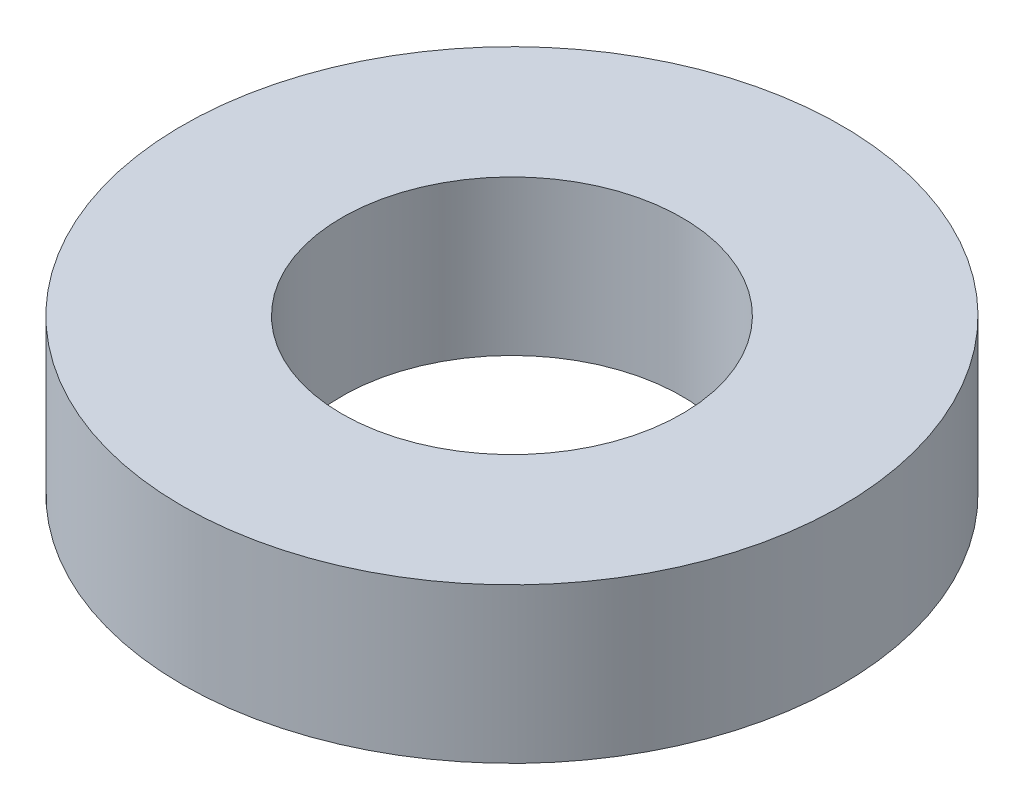
ISO-10303-21;
HEADER;
FILE_DESCRIPTION(('STEP AP214'),'2;1');
FILE_NAME('part.step','',(''),(''),'','','');
FILE_SCHEMA(('AUTOMOTIVE_DESIGN { 1 0 10303 214 1 1 1 1 }'));
ENDSEC;
DATA;
#1=APPLICATION_CONTEXT('core data for automotive mechanical design processes');
#2=APPLICATION_PROTOCOL_DEFINITION('international standard','automotive_design',2000,#1);
#3=PRODUCT_CONTEXT('',#1,'mechanical');
#4=PRODUCT('Part','Part','',(#3));
#5=PRODUCT_RELATED_PRODUCT_CATEGORY('part','',(#4));
#6=PRODUCT_DEFINITION_FORMATION('','',#4);
#7=PRODUCT_DEFINITION_CONTEXT('part definition',#1,'design');
#8=PRODUCT_DEFINITION('design','',#6,#7);
#9=PRODUCT_DEFINITION_SHAPE('','',#8);
#10=(LENGTH_UNIT() NAMED_UNIT(*) SI_UNIT(.MILLI.,.METRE.));
#11=(NAMED_UNIT(*) PLANE_ANGLE_UNIT() SI_UNIT($,.RADIAN.));
#12=(NAMED_UNIT(*) SI_UNIT($,.STERADIAN.) SOLID_ANGLE_UNIT());
#13=UNCERTAINTY_MEASURE_WITH_UNIT(LENGTH_MEASURE(1.E-05),#10,'distance_accuracy_value','');
#14=(GEOMETRIC_REPRESENTATION_CONTEXT(3) GLOBAL_UNCERTAINTY_ASSIGNED_CONTEXT((#13)) GLOBAL_UNIT_ASSIGNED_CONTEXT((#10,
#11,#12)) REPRESENTATION_CONTEXT('',''));
#15=CARTESIAN_POINT('',(0.,0.,0.));
#16=DIRECTION('',(0.,0.,1.));
#17=DIRECTION('',(1.,0.,0.));
#18=AXIS2_PLACEMENT_3D('',#15,#16,#17);
#19=CARTESIAN_POINT('',(0.,2.97942,0.));
#20=DIRECTION('',(0.,1.,0.));
#21=DIRECTION('',(0.,0.,1.));
#22=AXIS2_PLACEMENT_3D('',#19,#20,#21);
#23=PLANE('',#22);
#24=CARTESIAN_POINT('',(0.,2.97942,0.));
#25=DIRECTION('',(0.,1.,0.));
#26=DIRECTION('',(0.,0.,1.));
#27=AXIS2_PLACEMENT_3D('',#24,#25,#26);
#28=CIRCLE('',#27,6.35);
#29=CARTESIAN_POINT('',(0.,2.97942,6.35));
#30=VERTEX_POINT('',#29);
#31=EDGE_CURVE('E10',#30,#30,#28,.T.);
#32=ORIENTED_EDGE('',*,*,#31,.T.);
#33=EDGE_LOOP('',(#32));
#34=FACE_BOUND('',#33,.T.);
#35=CARTESIAN_POINT('',(0.,2.97942,0.));
#36=DIRECTION('',(0.,1.,0.));
#37=DIRECTION('',(0.,0.,1.));
#38=AXIS2_PLACEMENT_3D('',#35,#36,#37);
#39=CIRCLE('',#38,3.2766);
#40=CARTESIAN_POINT('',(0.,2.97942,3.2766));
#41=VERTEX_POINT('',#40);
#42=EDGE_CURVE('E54',#41,#41,#39,.T.);
#43=ORIENTED_EDGE('',*,*,#42,.F.);
#44=EDGE_LOOP('',(#43));
#45=FACE_BOUND('',#44,.T.);
#46=ADVANCED_FACE('F41',(#34,#45),#23,.T.);
#47=CARTESIAN_POINT('',(0.,0.,0.));
#48=DIRECTION('',(0.,1.,0.));
#49=DIRECTION('',(0.,0.,1.));
#50=AXIS2_PLACEMENT_3D('',#47,#48,#49);
#51=PLANE('',#50);
#52=CARTESIAN_POINT('',(0.,0.,0.));
#53=DIRECTION('',(0.,1.,0.));
#54=DIRECTION('',(0.,0.,1.));
#55=AXIS2_PLACEMENT_3D('',#52,#53,#54);
#56=CIRCLE('',#55,6.35);
#57=CARTESIAN_POINT('',(0.,0.,6.35));
#58=VERTEX_POINT('',#57);
#59=EDGE_CURVE('E45',#58,#58,#56,.T.);
#60=ORIENTED_EDGE('',*,*,#59,.F.);
#61=EDGE_LOOP('',(#60));
#62=FACE_BOUND('',#61,.T.);
#63=CARTESIAN_POINT('',(0.,0.,0.));
#64=DIRECTION('',(0.,1.,0.));
#65=DIRECTION('',(0.,0.,1.));
#66=AXIS2_PLACEMENT_3D('',#63,#64,#65);
#67=CIRCLE('',#66,3.2766);
#68=CARTESIAN_POINT('',(0.,0.,3.2766));
#69=VERTEX_POINT('',#68);
#70=EDGE_CURVE('E56',#69,#69,#67,.T.);
#71=ORIENTED_EDGE('',*,*,#70,.T.);
#72=EDGE_LOOP('',(#71));
#73=FACE_BOUND('',#72,.T.);
#74=ADVANCED_FACE('F68',(#62,#73),#51,.F.);
#75=CARTESIAN_POINT('',(0.,2.97942,0.));
#76=DIRECTION('',(0.,-1.,0.));
#77=DIRECTION('',(0.,0.,-1.));
#78=AXIS2_PLACEMENT_3D('',#75,#76,#77);
#79=CYLINDRICAL_SURFACE('',#78,6.35);
#80=ORIENTED_EDGE('',*,*,#31,.F.);
#81=EDGE_LOOP('',(#80));
#82=FACE_BOUND('',#81,.T.);
#83=ORIENTED_EDGE('',*,*,#59,.T.);
#84=EDGE_LOOP('',(#83));
#85=FACE_BOUND('',#84,.T.);
#86=ADVANCED_FACE('F43',(#82,#85),#79,.T.);
#87=CARTESIAN_POINT('',(0.,2.97942,0.));
#88=DIRECTION('',(0.,-1.,0.));
#89=DIRECTION('',(0.,0.,-1.));
#90=AXIS2_PLACEMENT_3D('',#87,#88,#89);
#91=CYLINDRICAL_SURFACE('',#90,3.2766);
#92=ORIENTED_EDGE('',*,*,#42,.T.);
#93=EDGE_LOOP('',(#92));
#94=FACE_BOUND('',#93,.T.);
#95=ORIENTED_EDGE('',*,*,#70,.F.);
#96=EDGE_LOOP('',(#95));
#97=FACE_BOUND('',#96,.T.);
#98=ADVANCED_FACE('F64',(#94,#97),#91,.F.);
#99=CLOSED_SHELL('',(#46,#74,#86,#98));
#100=MANIFOLD_SOLID_BREP('B2',#99);
#101=ADVANCED_BREP_SHAPE_REPRESENTATION('',(#18,#100),#14);
#102=SHAPE_DEFINITION_REPRESENTATION(#9,#101);
ENDSEC;
END-ISO-10303-21;
